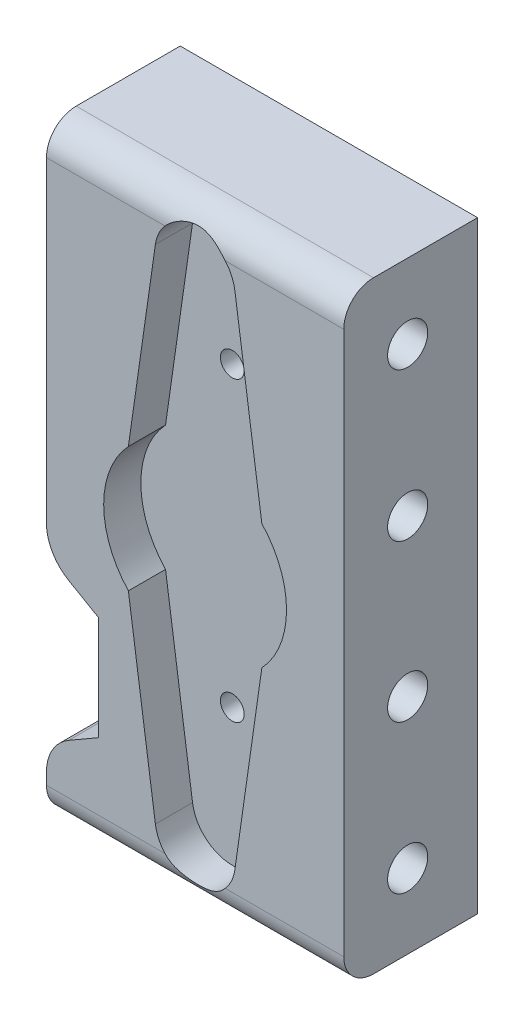
ISO-10303-21;
HEADER;
FILE_DESCRIPTION(('STEP AP214'),'2;1');
FILE_NAME('part.step','',(''),(''),'','','');
FILE_SCHEMA(('AUTOMOTIVE_DESIGN { 1 0 10303 214 1 1 1 1 }'));
ENDSEC;
DATA;
#1=APPLICATION_CONTEXT('core data for automotive mechanical design processes');
#2=APPLICATION_PROTOCOL_DEFINITION('international standard','automotive_design',2000,#1);
#3=PRODUCT_CONTEXT('',#1,'mechanical');
#4=PRODUCT('Part','Part','',(#3));
#5=PRODUCT_RELATED_PRODUCT_CATEGORY('part','',(#4));
#6=PRODUCT_DEFINITION_FORMATION('','',#4);
#7=PRODUCT_DEFINITION_CONTEXT('part definition',#1,'design');
#8=PRODUCT_DEFINITION('design','',#6,#7);
#9=PRODUCT_DEFINITION_SHAPE('','',#8);
#10=(LENGTH_UNIT() NAMED_UNIT(*) SI_UNIT(.MILLI.,.METRE.));
#11=(NAMED_UNIT(*) PLANE_ANGLE_UNIT() SI_UNIT($,.RADIAN.));
#12=(NAMED_UNIT(*) SI_UNIT($,.STERADIAN.) SOLID_ANGLE_UNIT());
#13=UNCERTAINTY_MEASURE_WITH_UNIT(LENGTH_MEASURE(1.E-05),#10,'distance_accuracy_value','');
#14=(GEOMETRIC_REPRESENTATION_CONTEXT(3) GLOBAL_UNCERTAINTY_ASSIGNED_CONTEXT((#13)) GLOBAL_UNIT_ASSIGNED_CONTEXT((#10,
#11,#12)) REPRESENTATION_CONTEXT('',''));
#15=CARTESIAN_POINT('',(0.,0.,0.));
#16=DIRECTION('',(0.,0.,1.));
#17=DIRECTION('',(1.,0.,0.));
#18=AXIS2_PLACEMENT_3D('',#15,#16,#17);
#19=CARTESIAN_POINT('',(-10.,20.28038,-9.));
#20=DIRECTION('',(-1.,0.,0.));
#21=DIRECTION('',(0.,-1.,0.));
#22=AXIS2_PLACEMENT_3D('',#19,#20,#21);
#23=PLANE('',#22);
#24=DIRECTION('',(0.,-1.,0.));
#25=VECTOR('',#24,1.);
#26=CARTESIAN_POINT('',(-10.,20.28038,0.));
#27=LINE('',#26,#25);
#28=CARTESIAN_POINT('',(-10.,-17.5179467497326,0.));
#29=VERTEX_POINT('',#28);
#30=CARTESIAN_POINT('',(-10.,-18.28038,0.));
#31=VERTEX_POINT('',#30);
#32=EDGE_CURVE('E298',#29,#31,#27,.T.);
#33=ORIENTED_EDGE('',*,*,#32,.F.);
#34=DIRECTION('',(0.,0.,-1.));
#35=VECTOR('',#34,1.);
#36=CARTESIAN_POINT('',(-10.,-17.5179467497326,-8.99999999999999));
#37=LINE('',#36,#35);
#38=CARTESIAN_POINT('',(-10.,-17.5179467497326,-9.));
#39=VERTEX_POINT('',#38);
#40=EDGE_CURVE('E43',#29,#39,#37,.T.);
#41=ORIENTED_EDGE('',*,*,#40,.T.);
#42=DIRECTION('',(0.,-1.,0.));
#43=VECTOR('',#42,1.);
#44=CARTESIAN_POINT('',(-10.,20.28038,-9.));
#45=LINE('',#44,#43);
#46=CARTESIAN_POINT('',(-10.,-20.28038,-9.));
#47=VERTEX_POINT('',#46);
#48=EDGE_CURVE('E322',#39,#47,#45,.T.);
#49=ORIENTED_EDGE('',*,*,#48,.T.);
#50=DIRECTION('',(0.,0.,1.));
#51=VECTOR('',#50,1.);
#52=CARTESIAN_POINT('',(-10.,-20.28038,-9.));
#53=LINE('',#52,#51);
#54=CARTESIAN_POINT('',(-10.,-20.28038,-2.));
#55=VERTEX_POINT('',#54);
#56=EDGE_CURVE('E345',#47,#55,#53,.T.);
#57=ORIENTED_EDGE('',*,*,#56,.T.);
#58=CARTESIAN_POINT('',(-10.,-18.28038,-2.));
#59=DIRECTION('',(-1.,0.,0.));
#60=DIRECTION('',(0.,-1.,0.));
#61=AXIS2_PLACEMENT_3D('',#58,#59,#60);
#62=CIRCLE('',#61,2.);
#63=EDGE_CURVE('E456',#55,#31,#62,.T.);
#64=ORIENTED_EDGE('',*,*,#63,.T.);
#65=EDGE_LOOP('',(#33,#41,#49,#57,#64));
#66=FACE_BOUND('',#65,.T.);
#67=ADVANCED_FACE('F35',(#66),#23,.T.);
#68=CARTESIAN_POINT('',(0.,0.,0.));
#69=DIRECTION('',(0.,0.,1.));
#70=DIRECTION('',(1.,0.,0.));
#71=AXIS2_PLACEMENT_3D('',#68,#69,#70);
#72=PLANE('',#71);
#73=CARTESIAN_POINT('',(-10.,18.28038,0.));
#74=VERTEX_POINT('',#73);
#75=CARTESIAN_POINT('',(-10.,-3.01239325026743,0.));
#76=VERTEX_POINT('',#75);
#77=EDGE_CURVE('E334',#74,#76,#27,.T.);
#78=ORIENTED_EDGE('',*,*,#77,.T.);
#79=CARTESIAN_POINT('',(-7.,-3.01239325026743,0.));
#80=DIRECTION('',(0.,0.,1.));
#81=DIRECTION('',(1.,0.,0.));
#82=AXIS2_PLACEMENT_3D('',#79,#80,#81);
#83=CIRCLE('',#82,3.);
#84=CARTESIAN_POINT('',(-8.5,-5.61046946162075,0.));
#85=VERTEX_POINT('',#84);
#86=EDGE_CURVE('E189',#76,#85,#83,.T.);
#87=ORIENTED_EDGE('',*,*,#86,.T.);
#88=DIRECTION('',(0.866025403784439,-0.499999999999999,0.));
#89=VECTOR('',#88,1.);
#90=CARTESIAN_POINT('',(-4.55440454046017,-7.88846006229943,0.));
#91=LINE('',#90,#89);
#92=CARTESIAN_POINT('',(-6.5,-6.76517,0.));
#93=VERTEX_POINT('',#92);
#94=EDGE_CURVE('E183',#85,#93,#91,.T.);
#95=ORIENTED_EDGE('',*,*,#94,.T.);
#96=DIRECTION('',(0.,1.,0.));
#97=VECTOR('',#96,1.);
#98=CARTESIAN_POINT('',(-6.5,-13.76517,0.));
#99=LINE('',#98,#97);
#100=CARTESIAN_POINT('',(-6.5,-13.76517,0.));
#101=VERTEX_POINT('',#100);
#102=EDGE_CURVE('E188',#101,#93,#99,.T.);
#103=ORIENTED_EDGE('',*,*,#102,.F.);
#104=DIRECTION('',(-0.86602540378444,-0.499999999999998,0.));
#105=VECTOR('',#104,1.);
#106=CARTESIAN_POINT('',(4.33549345370573,-7.50929493770062,0.));
#107=LINE('',#106,#105);
#108=CARTESIAN_POINT('',(-8.49999999999999,-14.9198705383793,0.));
#109=VERTEX_POINT('',#108);
#110=EDGE_CURVE('E194',#101,#109,#107,.T.);
#111=ORIENTED_EDGE('',*,*,#110,.T.);
#112=CARTESIAN_POINT('',(-7.,-17.5179467497326,0.));
#113=DIRECTION('',(0.,0.,1.));
#114=DIRECTION('',(1.,0.,0.));
#115=AXIS2_PLACEMENT_3D('',#112,#113,#114);
#116=CIRCLE('',#115,3.);
#117=EDGE_CURVE('E459',#109,#29,#116,.T.);
#118=ORIENTED_EDGE('',*,*,#117,.T.);
#119=ORIENTED_EDGE('',*,*,#32,.T.);
#120=DIRECTION('',(1.,0.,0.));
#121=VECTOR('',#120,1.);
#122=CARTESIAN_POINT('',(0.,-18.28038,0.));
#123=LINE('',#122,#121);
#124=CARTESIAN_POINT('',(-2.02983916988513,-18.28038,0.));
#125=VERTEX_POINT('',#124);
#126=EDGE_CURVE('E356',#31,#125,#123,.T.);
#127=ORIENTED_EDGE('',*,*,#126,.T.);
#128=CARTESIAN_POINT('',(0.,-16.5,0.));
#129=DIRECTION('',(0.,0.,1.));
#130=DIRECTION('',(1.,0.,0.));
#131=AXIS2_PLACEMENT_3D('',#128,#129,#130);
#132=CIRCLE('',#131,2.7);
#133=CARTESIAN_POINT('',(-2.67271739351377,-16.8828599409822,0.));
#134=VERTEX_POINT('',#133);
#135=EDGE_CURVE('E258',#134,#125,#132,.T.);
#136=ORIENTED_EDGE('',*,*,#135,.F.);
#137=DIRECTION('',(0.141799978141564,-0.989895330931029,0.));
#138=VECTOR('',#137,1.);
#139=CARTESIAN_POINT('',(-4.48896436219852,-4.2037719913087,0.));
#140=LINE('',#139,#138);
#141=CARTESIAN_POINT('',(-4.48896436219852,-4.2037719913087,0.));
#142=VERTEX_POINT('',#141);
#143=EDGE_CURVE('E254',#142,#134,#140,.T.);
#144=ORIENTED_EDGE('',*,*,#143,.F.);
#145=CARTESIAN_POINT('',(0.,0.,0.));
#146=DIRECTION('',(0.,0.,1.));
#147=DIRECTION('',(1.,0.,0.));
#148=AXIS2_PLACEMENT_3D('',#145,#146,#147);
#149=CIRCLE('',#148,6.14999999999999);
#150=CARTESIAN_POINT('',(-4.48896436219852,4.2037719913087,0.));
#151=VERTEX_POINT('',#150);
#152=EDGE_CURVE('E222',#151,#142,#149,.T.);
#153=ORIENTED_EDGE('',*,*,#152,.F.);
#154=DIRECTION('',(-0.141799978141563,-0.989895330931029,0.));
#155=VECTOR('',#154,1.);
#156=CARTESIAN_POINT('',(-2.67271739351378,16.8828599409822,0.));
#157=LINE('',#156,#155);
#158=CARTESIAN_POINT('',(-2.67271739351378,16.8828599409822,0.));
#159=VERTEX_POINT('',#158);
#160=EDGE_CURVE('E231',#159,#151,#157,.T.);
#161=ORIENTED_EDGE('',*,*,#160,.F.);
#162=CARTESIAN_POINT('',(0.,16.5,0.));
#163=DIRECTION('',(0.,0.,1.));
#164=DIRECTION('',(1.,0.,0.));
#165=AXIS2_PLACEMENT_3D('',#162,#163,#164);
#166=CIRCLE('',#165,2.7);
#167=CARTESIAN_POINT('',(-2.02983916988514,18.28038,0.));
#168=VERTEX_POINT('',#167);
#169=EDGE_CURVE('E270',#168,#159,#166,.T.);
#170=ORIENTED_EDGE('',*,*,#169,.F.);
#171=DIRECTION('',(-1.,0.,0.));
#172=VECTOR('',#171,1.);
#173=CARTESIAN_POINT('',(0.,18.28038,0.));
#174=LINE('',#173,#172);
#175=EDGE_CURVE('E341',#168,#74,#174,.T.);
#176=ORIENTED_EDGE('',*,*,#175,.T.);
#177=EDGE_LOOP('',(#78,#87,#95,#103,#111,#118,#119,#127,#136,#144,#153,#161,#170,#176));
#178=FACE_BOUND('',#177,.T.);
#179=ADVANCED_FACE('F186',(#178),#72,.T.);
#180=CARTESIAN_POINT('',(10.,20.28038,-9.));
#181=DIRECTION('',(0.,1.,0.));
#182=DIRECTION('',(0.,0.,1.));
#183=AXIS2_PLACEMENT_3D('',#180,#181,#182);
#184=PLANE('',#183);
#185=DIRECTION('',(0.,0.,1.));
#186=VECTOR('',#185,1.);
#187=CARTESIAN_POINT('',(-10.,20.28038,-9.));
#188=LINE('',#187,#186);
#189=CARTESIAN_POINT('',(-10.,20.28038,-9.));
#190=VERTEX_POINT('',#189);
#191=CARTESIAN_POINT('',(-10.,20.28038,-2.));
#192=VERTEX_POINT('',#191);
#193=EDGE_CURVE('E333',#190,#192,#188,.T.);
#194=ORIENTED_EDGE('',*,*,#193,.T.);
#195=DIRECTION('',(-1.,0.,0.));
#196=VECTOR('',#195,1.);
#197=CARTESIAN_POINT('',(10.,20.28038,-2.));
#198=LINE('',#197,#196);
#199=CARTESIAN_POINT('',(10.,20.28038,-2.));
#200=VERTEX_POINT('',#199);
#201=EDGE_CURVE('E474',#192,#200,#198,.F.);
#202=ORIENTED_EDGE('',*,*,#201,.T.);
#203=DIRECTION('',(0.,0.,1.));
#204=VECTOR('',#203,1.);
#205=CARTESIAN_POINT('',(10.,20.28038,-9.));
#206=LINE('',#205,#204);
#207=CARTESIAN_POINT('',(10.,20.28038,-9.));
#208=VERTEX_POINT('',#207);
#209=EDGE_CURVE('E338',#208,#200,#206,.T.);
#210=ORIENTED_EDGE('',*,*,#209,.F.);
#211=DIRECTION('',(-1.,0.,0.));
#212=VECTOR('',#211,1.);
#213=CARTESIAN_POINT('',(10.,20.28038,-9.));
#214=LINE('',#213,#212);
#215=EDGE_CURVE('E319',#208,#190,#214,.T.);
#216=ORIENTED_EDGE('',*,*,#215,.T.);
#217=EDGE_LOOP('',(#194,#202,#210,#216));
#218=FACE_BOUND('',#217,.T.);
#219=ADVANCED_FACE('F435',(#218),#184,.T.);
#220=CARTESIAN_POINT('',(10.,-20.28038,-9.));
#221=DIRECTION('',(1.,0.,0.));
#222=DIRECTION('',(0.,0.,-1.));
#223=AXIS2_PLACEMENT_3D('',#220,#221,#222);
#224=PLANE('',#223);
#225=CARTESIAN_POINT('',(10.,-15.26519,-4.3));
#226=DIRECTION('',(1.,0.,0.));
#227=DIRECTION('',(0.,0.,1.));
#228=AXIS2_PLACEMENT_3D('',#225,#226,#227);
#229=CIRCLE('',#228,1.35);
#230=CARTESIAN_POINT('',(10.,-15.26519,-2.95));
#231=VERTEX_POINT('',#230);
#232=EDGE_CURVE('E299',#231,#231,#229,.T.);
#233=ORIENTED_EDGE('',*,*,#232,.F.);
#234=EDGE_LOOP('',(#233));
#235=FACE_BOUND('',#234,.T.);
#236=CARTESIAN_POINT('',(10.,5.26519,-4.3));
#237=DIRECTION('',(1.,0.,0.));
#238=DIRECTION('',(0.,0.,1.));
#239=AXIS2_PLACEMENT_3D('',#236,#237,#238);
#240=CIRCLE('',#239,1.35);
#241=CARTESIAN_POINT('',(10.,5.26519,-2.95));
#242=VERTEX_POINT('',#241);
#243=EDGE_CURVE('E278',#242,#242,#240,.T.);
#244=ORIENTED_EDGE('',*,*,#243,.F.);
#245=EDGE_LOOP('',(#244));
#246=FACE_BOUND('',#245,.T.);
#247=CARTESIAN_POINT('',(10.,15.26519,-4.3));
#248=DIRECTION('',(1.,0.,0.));
#249=DIRECTION('',(0.,0.,-1.));
#250=AXIS2_PLACEMENT_3D('',#247,#248,#249);
#251=CIRCLE('',#250,1.35);
#252=CARTESIAN_POINT('',(10.,15.26519,-5.65));
#253=VERTEX_POINT('',#252);
#254=EDGE_CURVE('E306',#253,#253,#251,.T.);
#255=ORIENTED_EDGE('',*,*,#254,.F.);
#256=EDGE_LOOP('',(#255));
#257=FACE_BOUND('',#256,.T.);
#258=CARTESIAN_POINT('',(10.,-5.26519,-4.3));
#259=DIRECTION('',(1.,0.,0.));
#260=DIRECTION('',(0.,0.,-1.));
#261=AXIS2_PLACEMENT_3D('',#258,#259,#260);
#262=CIRCLE('',#261,1.35);
#263=CARTESIAN_POINT('',(10.,-5.26519,-5.65));
#264=VERTEX_POINT('',#263);
#265=EDGE_CURVE('E311',#264,#264,#262,.T.);
#266=ORIENTED_EDGE('',*,*,#265,.F.);
#267=EDGE_LOOP('',(#266));
#268=FACE_BOUND('',#267,.T.);
#269=DIRECTION('',(0.,1.,0.));
#270=VECTOR('',#269,1.);
#271=CARTESIAN_POINT('',(10.,-20.28038,0.));
#272=LINE('',#271,#270);
#273=CARTESIAN_POINT('',(10.,-18.28038,0.));
#274=VERTEX_POINT('',#273);
#275=CARTESIAN_POINT('',(10.,18.28038,0.));
#276=VERTEX_POINT('',#275);
#277=EDGE_CURVE('E323',#274,#276,#272,.T.);
#278=ORIENTED_EDGE('',*,*,#277,.F.);
#279=CARTESIAN_POINT('',(10.,-18.28038,-2.));
#280=DIRECTION('',(1.,0.,0.));
#281=DIRECTION('',(0.,0.,-1.));
#282=AXIS2_PLACEMENT_3D('',#279,#280,#281);
#283=CIRCLE('',#282,2.);
#284=CARTESIAN_POINT('',(10.,-20.28038,-2.));
#285=VERTEX_POINT('',#284);
#286=EDGE_CURVE('E520',#274,#285,#283,.T.);
#287=ORIENTED_EDGE('',*,*,#286,.T.);
#288=DIRECTION('',(0.,0.,1.));
#289=VECTOR('',#288,1.);
#290=CARTESIAN_POINT('',(10.,-20.28038,-9.));
#291=LINE('',#290,#289);
#292=CARTESIAN_POINT('',(10.,-20.28038,-9.));
#293=VERTEX_POINT('',#292);
#294=EDGE_CURVE('E342',#293,#285,#291,.T.);
#295=ORIENTED_EDGE('',*,*,#294,.F.);
#296=DIRECTION('',(0.,1.,0.));
#297=VECTOR('',#296,1.);
#298=CARTESIAN_POINT('',(10.,-20.28038,-9.));
#299=LINE('',#298,#297);
#300=EDGE_CURVE('E330',#293,#208,#299,.T.);
#301=ORIENTED_EDGE('',*,*,#300,.T.);
#302=ORIENTED_EDGE('',*,*,#209,.T.);
#303=CARTESIAN_POINT('',(10.,18.28038,-2.));
#304=DIRECTION('',(1.,0.,0.));
#305=DIRECTION('',(0.,0.,-1.));
#306=AXIS2_PLACEMENT_3D('',#303,#304,#305);
#307=CIRCLE('',#306,2.);
#308=EDGE_CURVE('E367',#200,#276,#307,.T.);
#309=ORIENTED_EDGE('',*,*,#308,.T.);
#310=EDGE_LOOP('',(#278,#287,#295,#301,#302,#309));
#311=FACE_BOUND('',#310,.T.);
#312=ADVANCED_FACE('F431',(#235,#246,#257,#268,#311),#224,.T.);
#313=CARTESIAN_POINT('',(-10.,-20.28038,-9.));
#314=DIRECTION('',(0.,-1.,0.));
#315=DIRECTION('',(0.,0.,-1.));
#316=AXIS2_PLACEMENT_3D('',#313,#314,#315);
#317=PLANE('',#316);
#318=ORIENTED_EDGE('',*,*,#294,.T.);
#319=DIRECTION('',(1.,0.,0.));
#320=VECTOR('',#319,1.);
#321=CARTESIAN_POINT('',(-10.,-20.28038,-2.));
#322=LINE('',#321,#320);
#323=EDGE_CURVE('E521',#285,#55,#322,.F.);
#324=ORIENTED_EDGE('',*,*,#323,.T.);
#325=ORIENTED_EDGE('',*,*,#56,.F.);
#326=DIRECTION('',(1.,0.,0.));
#327=VECTOR('',#326,1.);
#328=CARTESIAN_POINT('',(-10.,-20.28038,-9.));
#329=LINE('',#328,#327);
#330=EDGE_CURVE('E327',#47,#293,#329,.T.);
#331=ORIENTED_EDGE('',*,*,#330,.T.);
#332=EDGE_LOOP('',(#318,#324,#325,#331));
#333=FACE_BOUND('',#332,.T.);
#334=ADVANCED_FACE('F434',(#333),#317,.T.);
#335=CARTESIAN_POINT('',(-10.,-3.01239325026743,-9.));
#336=VERTEX_POINT('',#335);
#337=EDGE_CURVE('E324',#190,#336,#45,.T.);
#338=ORIENTED_EDGE('',*,*,#337,.T.);
#339=DIRECTION('',(0.,0.,1.));
#340=VECTOR('',#339,1.);
#341=CARTESIAN_POINT('',(-10.,-3.01239325026743,-8.99999999999999));
#342=LINE('',#341,#340);
#343=EDGE_CURVE('E193',#336,#76,#342,.T.);
#344=ORIENTED_EDGE('',*,*,#343,.T.);
#345=ORIENTED_EDGE('',*,*,#77,.F.);
#346=CARTESIAN_POINT('',(-10.,18.28038,-2.));
#347=DIRECTION('',(-1.,0.,0.));
#348=DIRECTION('',(0.,-1.,0.));
#349=AXIS2_PLACEMENT_3D('',#346,#347,#348);
#350=CIRCLE('',#349,2.);
#351=EDGE_CURVE('E523',#74,#192,#350,.T.);
#352=ORIENTED_EDGE('',*,*,#351,.T.);
#353=ORIENTED_EDGE('',*,*,#193,.F.);
#354=EDGE_LOOP('',(#338,#344,#345,#352,#353));
#355=FACE_BOUND('',#354,.T.);
#356=ADVANCED_FACE('F427',(#355),#23,.T.);
#357=CARTESIAN_POINT('',(0.,0.,-9.));
#358=DIRECTION('',(0.,0.,1.));
#359=DIRECTION('',(1.,0.,0.));
#360=AXIS2_PLACEMENT_3D('',#357,#358,#359);
#361=PLANE('',#360);
#362=DIRECTION('',(-0.866025403784439,0.499999999999999,0.));
#363=VECTOR('',#362,1.);
#364=CARTESIAN_POINT('',(-6.49999999999999,-6.76517,-9.));
#365=LINE('',#364,#363);
#366=CARTESIAN_POINT('',(-6.5,-6.76517,-9.));
#367=VERTEX_POINT('',#366);
#368=CARTESIAN_POINT('',(-8.5,-5.61046946162075,-9.));
#369=VERTEX_POINT('',#368);
#370=EDGE_CURVE('E208',#367,#369,#365,.T.);
#371=ORIENTED_EDGE('',*,*,#370,.T.);
#372=CARTESIAN_POINT('',(-7.,-3.01239325026743,-9.));
#373=DIRECTION('',(0.,0.,1.));
#374=DIRECTION('',(1.,0.,0.));
#375=AXIS2_PLACEMENT_3D('',#372,#373,#374);
#376=CIRCLE('',#375,3.);
#377=EDGE_CURVE('E460',#369,#336,#376,.F.);
#378=ORIENTED_EDGE('',*,*,#377,.T.);
#379=ORIENTED_EDGE('',*,*,#337,.F.);
#380=ORIENTED_EDGE('',*,*,#215,.F.);
#381=ORIENTED_EDGE('',*,*,#300,.F.);
#382=ORIENTED_EDGE('',*,*,#330,.F.);
#383=ORIENTED_EDGE('',*,*,#48,.F.);
#384=CARTESIAN_POINT('',(-7.,-17.5179467497326,-9.));
#385=DIRECTION('',(0.,0.,1.));
#386=DIRECTION('',(1.,0.,0.));
#387=AXIS2_PLACEMENT_3D('',#384,#385,#386);
#388=CIRCLE('',#387,3.);
#389=CARTESIAN_POINT('',(-8.49999999999999,-14.9198705383793,-9.));
#390=VERTEX_POINT('',#389);
#391=EDGE_CURVE('E50',#39,#390,#388,.F.);
#392=ORIENTED_EDGE('',*,*,#391,.T.);
#393=DIRECTION('',(0.86602540378444,0.499999999999998,0.));
#394=VECTOR('',#393,1.);
#395=CARTESIAN_POINT('',(-6.49999999999997,-13.76517,-9.));
#396=LINE('',#395,#394);
#397=CARTESIAN_POINT('',(-6.5,-13.76517,-9.));
#398=VERTEX_POINT('',#397);
#399=EDGE_CURVE('E472',#390,#398,#396,.T.);
#400=ORIENTED_EDGE('',*,*,#399,.T.);
#401=DIRECTION('',(0.,-1.,0.));
#402=VECTOR('',#401,1.);
#403=CARTESIAN_POINT('',(-6.5,-6.76517,-9.));
#404=LINE('',#403,#402);
#405=EDGE_CURVE('E209',#367,#398,#404,.T.);
#406=ORIENTED_EDGE('',*,*,#405,.F.);
#407=EDGE_LOOP('',(#371,#378,#379,#380,#381,#382,#383,#392,#400,#406));
#408=FACE_BOUND('',#407,.T.);
#409=CARTESIAN_POINT('',(0.,10.,-9.));
#410=DIRECTION('',(0.,0.,1.));
#411=DIRECTION('',(1.,0.,0.));
#412=AXIS2_PLACEMENT_3D('',#409,#410,#411);
#413=CIRCLE('',#412,0.8);
#414=CARTESIAN_POINT('',(0.800000000000001,10.,-9.));
#415=VERTEX_POINT('',#414);
#416=EDGE_CURVE('E218',#415,#415,#413,.F.);
#417=ORIENTED_EDGE('',*,*,#416,.F.);
#418=EDGE_LOOP('',(#417));
#419=FACE_BOUND('',#418,.T.);
#420=CARTESIAN_POINT('',(0.,-10.,-9.));
#421=DIRECTION('',(0.,0.,1.));
#422=DIRECTION('',(1.,0.,0.));
#423=AXIS2_PLACEMENT_3D('',#420,#421,#422);
#424=CIRCLE('',#423,0.8);
#425=CARTESIAN_POINT('',(0.800000000000001,-10.,-9.));
#426=VERTEX_POINT('',#425);
#427=EDGE_CURVE('E219',#426,#426,#424,.F.);
#428=ORIENTED_EDGE('',*,*,#427,.F.);
#429=EDGE_LOOP('',(#428));
#430=FACE_BOUND('',#429,.T.);
#431=ADVANCED_FACE('F424',(#408,#419,#430),#361,.F.);
#432=CARTESIAN_POINT('',(2.02983916988514,-18.28038,0.));
#433=VERTEX_POINT('',#432);
#434=CARTESIAN_POINT('',(2.67271739351378,-16.8828599409822,0.));
#435=VERTEX_POINT('',#434);
#436=EDGE_CURVE('E257',#433,#435,#132,.T.);
#437=ORIENTED_EDGE('',*,*,#436,.F.);
#438=DIRECTION('',(1.,0.,0.));
#439=VECTOR('',#438,1.);
#440=CARTESIAN_POINT('',(0.,-18.28038,0.));
#441=LINE('',#440,#439);
#442=EDGE_CURVE('E354',#433,#274,#441,.T.);
#443=ORIENTED_EDGE('',*,*,#442,.T.);
#444=ORIENTED_EDGE('',*,*,#277,.T.);
#445=DIRECTION('',(-1.,0.,0.));
#446=VECTOR('',#445,1.);
#447=CARTESIAN_POINT('',(0.,18.28038,0.));
#448=LINE('',#447,#446);
#449=CARTESIAN_POINT('',(2.02983916988514,18.28038,0.));
#450=VERTEX_POINT('',#449);
#451=EDGE_CURVE('E351',#276,#450,#448,.T.);
#452=ORIENTED_EDGE('',*,*,#451,.T.);
#453=CARTESIAN_POINT('',(2.67271739351378,16.8828599409822,0.));
#454=VERTEX_POINT('',#453);
#455=EDGE_CURVE('E271',#454,#450,#166,.T.);
#456=ORIENTED_EDGE('',*,*,#455,.F.);
#457=DIRECTION('',(-0.141799978141565,0.989895330931029,0.));
#458=VECTOR('',#457,1.);
#459=CARTESIAN_POINT('',(4.48896436219854,4.2037719913087,0.));
#460=LINE('',#459,#458);
#461=CARTESIAN_POINT('',(4.48896436219854,4.2037719913087,0.));
#462=VERTEX_POINT('',#461);
#463=EDGE_CURVE('E267',#462,#454,#460,.T.);
#464=ORIENTED_EDGE('',*,*,#463,.F.);
#465=CARTESIAN_POINT('',(0.,0.,0.));
#466=DIRECTION('',(0.,0.,1.));
#467=DIRECTION('',(1.,0.,0.));
#468=AXIS2_PLACEMENT_3D('',#465,#466,#467);
#469=CIRCLE('',#468,6.15);
#470=CARTESIAN_POINT('',(4.48896436219854,-4.2037719913087,0.));
#471=VERTEX_POINT('',#470);
#472=EDGE_CURVE('E264',#471,#462,#469,.T.);
#473=ORIENTED_EDGE('',*,*,#472,.F.);
#474=DIRECTION('',(0.141799978141564,0.989895330931029,0.));
#475=VECTOR('',#474,1.);
#476=CARTESIAN_POINT('',(2.67271739351378,-16.8828599409822,0.));
#477=LINE('',#476,#475);
#478=EDGE_CURVE('E261',#435,#471,#477,.T.);
#479=ORIENTED_EDGE('',*,*,#478,.F.);
#480=EDGE_LOOP('',(#437,#443,#444,#452,#456,#464,#473,#479));
#481=FACE_BOUND('',#480,.T.);
#482=ADVANCED_FACE('F416',(#481),#72,.T.);
#483=CARTESIAN_POINT('',(0.,-5.26519,-4.3));
#484=DIRECTION('',(1.,0.,0.));
#485=DIRECTION('',(0.,0.,-1.));
#486=AXIS2_PLACEMENT_3D('',#483,#484,#485);
#487=CYLINDRICAL_SURFACE('',#486,1.35);
#488=CARTESIAN_POINT('',(0.,-5.26519,-4.3));
#489=DIRECTION('',(1.,0.,0.));
#490=DIRECTION('',(0.,0.,-1.));
#491=AXIS2_PLACEMENT_3D('',#488,#489,#490);
#492=CIRCLE('',#491,1.35);
#493=CARTESIAN_POINT('',(0.,-5.26519,-5.65));
#494=VERTEX_POINT('',#493);
#495=EDGE_CURVE('E302',#494,#494,#492,.T.);
#496=ORIENTED_EDGE('',*,*,#495,.F.);
#497=EDGE_LOOP('',(#496));
#498=FACE_BOUND('',#497,.T.);
#499=ORIENTED_EDGE('',*,*,#265,.T.);
#500=EDGE_LOOP('',(#499));
#501=FACE_BOUND('',#500,.T.);
#502=ADVANCED_FACE('F412',(#498,#501),#487,.F.);
#503=CARTESIAN_POINT('',(0.,-5.26519,-4.3));
#504=DIRECTION('',(1.,0.,0.));
#505=DIRECTION('',(0.,0.,-1.));
#506=AXIS2_PLACEMENT_3D('',#503,#504,#505);
#507=PLANE('',#506);
#508=ORIENTED_EDGE('',*,*,#495,.T.);
#509=EDGE_LOOP('',(#508));
#510=FACE_BOUND('',#509,.T.);
#511=ADVANCED_FACE('F408',(#510),#507,.T.);
#512=CARTESIAN_POINT('',(0.,15.26519,-4.3));
#513=DIRECTION('',(1.,0.,0.));
#514=DIRECTION('',(0.,0.,-1.));
#515=AXIS2_PLACEMENT_3D('',#512,#513,#514);
#516=CYLINDRICAL_SURFACE('',#515,1.35);
#517=CARTESIAN_POINT('',(0.,15.26519,-4.3));
#518=DIRECTION('',(1.,0.,0.));
#519=DIRECTION('',(0.,0.,-1.));
#520=AXIS2_PLACEMENT_3D('',#517,#518,#519);
#521=CIRCLE('',#520,1.35);
#522=CARTESIAN_POINT('',(0.,15.26519,-5.65));
#523=VERTEX_POINT('',#522);
#524=EDGE_CURVE('E314',#523,#523,#521,.T.);
#525=ORIENTED_EDGE('',*,*,#524,.F.);
#526=EDGE_LOOP('',(#525));
#527=FACE_BOUND('',#526,.T.);
#528=ORIENTED_EDGE('',*,*,#254,.T.);
#529=EDGE_LOOP('',(#528));
#530=FACE_BOUND('',#529,.T.);
#531=ADVANCED_FACE('F411',(#527,#530),#516,.F.);
#532=CARTESIAN_POINT('',(0.,15.26519,-4.3));
#533=DIRECTION('',(1.,0.,0.));
#534=DIRECTION('',(0.,0.,-1.));
#535=AXIS2_PLACEMENT_3D('',#532,#533,#534);
#536=PLANE('',#535);
#537=ORIENTED_EDGE('',*,*,#524,.T.);
#538=EDGE_LOOP('',(#537));
#539=FACE_BOUND('',#538,.T.);
#540=ADVANCED_FACE('F406',(#539),#536,.T.);
#541=CARTESIAN_POINT('',(0.,5.26519,-4.3));
#542=DIRECTION('',(1.,0.,0.));
#543=DIRECTION('',(0.,0.,-1.));
#544=AXIS2_PLACEMENT_3D('',#541,#542,#543);
#545=CYLINDRICAL_SURFACE('',#544,1.35);
#546=CARTESIAN_POINT('',(0.,5.26519,-4.3));
#547=DIRECTION('',(1.,0.,0.));
#548=DIRECTION('',(0.,0.,1.));
#549=AXIS2_PLACEMENT_3D('',#546,#547,#548);
#550=CIRCLE('',#549,1.35);
#551=CARTESIAN_POINT('',(0.,5.26519,-2.95));
#552=VERTEX_POINT('',#551);
#553=EDGE_CURVE('E303',#552,#552,#550,.T.);
#554=ORIENTED_EDGE('',*,*,#553,.F.);
#555=EDGE_LOOP('',(#554));
#556=FACE_BOUND('',#555,.T.);
#557=ORIENTED_EDGE('',*,*,#243,.T.);
#558=EDGE_LOOP('',(#557));
#559=FACE_BOUND('',#558,.T.);
#560=ADVANCED_FACE('F402',(#556,#559),#545,.F.);
#561=CARTESIAN_POINT('',(0.,5.26519,-4.3));
#562=DIRECTION('',(-1.,0.,0.));
#563=DIRECTION('',(0.,0.,1.));
#564=AXIS2_PLACEMENT_3D('',#561,#562,#563);
#565=PLANE('',#564);
#566=ORIENTED_EDGE('',*,*,#553,.T.);
#567=EDGE_LOOP('',(#566));
#568=FACE_BOUND('',#567,.T.);
#569=ADVANCED_FACE('F398',(#568),#565,.F.);
#570=CARTESIAN_POINT('',(0.,-15.26519,-4.3));
#571=DIRECTION('',(1.,0.,0.));
#572=DIRECTION('',(0.,0.,-1.));
#573=AXIS2_PLACEMENT_3D('',#570,#571,#572);
#574=CYLINDRICAL_SURFACE('',#573,1.35);
#575=CARTESIAN_POINT('',(0.,-15.26519,-4.3));
#576=DIRECTION('',(1.,0.,0.));
#577=DIRECTION('',(0.,0.,1.));
#578=AXIS2_PLACEMENT_3D('',#575,#576,#577);
#579=CIRCLE('',#578,1.35);
#580=CARTESIAN_POINT('',(0.,-15.26519,-2.95));
#581=VERTEX_POINT('',#580);
#582=EDGE_CURVE('E295',#581,#581,#579,.T.);
#583=ORIENTED_EDGE('',*,*,#582,.F.);
#584=EDGE_LOOP('',(#583));
#585=FACE_BOUND('',#584,.T.);
#586=ORIENTED_EDGE('',*,*,#232,.T.);
#587=EDGE_LOOP('',(#586));
#588=FACE_BOUND('',#587,.T.);
#589=ADVANCED_FACE('F394',(#585,#588),#574,.F.);
#590=CARTESIAN_POINT('',(0.,-15.26519,-4.3));
#591=DIRECTION('',(-1.,0.,0.));
#592=DIRECTION('',(0.,0.,1.));
#593=AXIS2_PLACEMENT_3D('',#590,#591,#592);
#594=PLANE('',#593);
#595=ORIENTED_EDGE('',*,*,#582,.T.);
#596=EDGE_LOOP('',(#595));
#597=FACE_BOUND('',#596,.T.);
#598=ADVANCED_FACE('F390',(#597),#594,.F.);
#599=CARTESIAN_POINT('',(0.,0.,-2.5));
#600=DIRECTION('',(0.,0.,1.));
#601=DIRECTION('',(1.,0.,0.));
#602=AXIS2_PLACEMENT_3D('',#599,#600,#601);
#603=CYLINDRICAL_SURFACE('',#602,6.14999999999999);
#604=ORIENTED_EDGE('',*,*,#152,.T.);
#605=DIRECTION('',(0.,0.,1.));
#606=VECTOR('',#605,1.);
#607=CARTESIAN_POINT('',(-4.48896436219852,-4.2037719913087,-2.5));
#608=LINE('',#607,#606);
#609=CARTESIAN_POINT('',(-4.48896436219852,-4.2037719913087,-2.5));
#610=VERTEX_POINT('',#609);
#611=EDGE_CURVE('E252',#610,#142,#608,.T.);
#612=ORIENTED_EDGE('',*,*,#611,.F.);
#613=CARTESIAN_POINT('',(0.,0.,-2.5));
#614=DIRECTION('',(0.,0.,1.));
#615=DIRECTION('',(1.,0.,0.));
#616=AXIS2_PLACEMENT_3D('',#613,#614,#615);
#617=CIRCLE('',#616,6.14999999999999);
#618=CARTESIAN_POINT('',(-4.48896436219852,4.2037719913087,-2.5));
#619=VERTEX_POINT('',#618);
#620=EDGE_CURVE('E227',#619,#610,#617,.T.);
#621=ORIENTED_EDGE('',*,*,#620,.F.);
#622=DIRECTION('',(0.,0.,1.));
#623=VECTOR('',#622,1.);
#624=CARTESIAN_POINT('',(-4.48896436219852,4.2037719913087,-2.5));
#625=LINE('',#624,#623);
#626=EDGE_CURVE('E276',#619,#151,#625,.T.);
#627=ORIENTED_EDGE('',*,*,#626,.T.);
#628=EDGE_LOOP('',(#604,#612,#621,#627));
#629=FACE_BOUND('',#628,.T.);
#630=ADVANCED_FACE('F386',(#629),#603,.F.);
#631=CARTESIAN_POINT('',(-2.67271739351378,16.8828599409822,-2.5));
#632=DIRECTION('',(-0.989895330931029,0.141799978141563,0.));
#633=DIRECTION('',(-0.141799978141563,-0.989895330931029,0.));
#634=AXIS2_PLACEMENT_3D('',#631,#632,#633);
#635=PLANE('',#634);
#636=ORIENTED_EDGE('',*,*,#160,.T.);
#637=ORIENTED_EDGE('',*,*,#626,.F.);
#638=DIRECTION('',(-0.141799978141563,-0.989895330931029,0.));
#639=VECTOR('',#638,1.);
#640=CARTESIAN_POINT('',(-2.67271739351378,16.8828599409822,-2.5));
#641=LINE('',#640,#639);
#642=CARTESIAN_POINT('',(-2.67271739351378,16.8828599409822,-2.5));
#643=VERTEX_POINT('',#642);
#644=EDGE_CURVE('E249',#643,#619,#641,.T.);
#645=ORIENTED_EDGE('',*,*,#644,.F.);
#646=DIRECTION('',(0.,0.,1.));
#647=VECTOR('',#646,1.);
#648=CARTESIAN_POINT('',(-2.67271739351378,16.8828599409822,-2.5));
#649=LINE('',#648,#647);
#650=EDGE_CURVE('E279',#643,#159,#649,.T.);
#651=ORIENTED_EDGE('',*,*,#650,.T.);
#652=EDGE_LOOP('',(#636,#637,#645,#651));
#653=FACE_BOUND('',#652,.T.);
#654=ADVANCED_FACE('F389',(#653),#635,.F.);
#655=CARTESIAN_POINT('',(0.,16.5,-2.5));
#656=DIRECTION('',(0.,0.,1.));
#657=DIRECTION('',(1.,0.,0.));
#658=AXIS2_PLACEMENT_3D('',#655,#656,#657);
#659=CYLINDRICAL_SURFACE('',#658,2.7);
#660=ORIENTED_EDGE('',*,*,#455,.T.);
#661=CARTESIAN_POINT('',(2.02983916988514,18.28038,0.));
#662=CARTESIAN_POINT('',(1.98290264200888,18.333901362581,-3.40372899482451E-06));
#663=CARTESIAN_POINT('',(1.93389335646955,18.385498833395,-0.00214717601543784));
#664=CARTESIAN_POINT('',(1.83216143453154,18.4844922950405,-0.00982372300805636));
#665=CARTESIAN_POINT('',(1.77944372842986,18.5318936818951,-0.0153520706109146));
#666=CARTESIAN_POINT('',(1.6165164077825,18.6671993293538,-0.035648337614392));
#667=CARTESIAN_POINT('',(1.50124012164818,18.7485367861416,-0.0541384330219366));
#668=CARTESIAN_POINT('',(1.26051108498245,18.8918005008512,-0.094301765624605));
#669=CARTESIAN_POINT('',(1.13509969622722,18.9538010900261,-0.115962331303129));
#670=CARTESIAN_POINT('',(0.875619439884857,19.0578861014717,-0.156463349259888));
#671=CARTESIAN_POINT('',(0.741546620455136,19.0999613586808,-0.17530250105263));
#672=CARTESIAN_POINT('',(0.530201531429635,19.1485361187801,-0.198154097377698));
#673=CARTESIAN_POINT('',(0.454887639409383,19.1625100193531,-0.205010869584907));
#674=CARTESIAN_POINT('',(0.303111847177834,19.1840250060831,-0.215742343559848));
#675=CARTESIAN_POINT('',(0.226649936330821,19.1915660326057,-0.219617017682807));
#676=CARTESIAN_POINT('',(0.0733436456867847,19.200094551377,-0.224007994687031));
#677=CARTESIAN_POINT('',(-0.00350027452759387,19.2010885975772,-0.22452765614318));
#678=CARTESIAN_POINT('',(-0.156936385237424,19.1965275501606,-0.22216972524549));
#679=CARTESIAN_POINT('',(-0.233528593425646,19.1909729271674,-0.219292377019649));
#680=CARTESIAN_POINT('',(-0.37757285103788,19.1743437424501,-0.210892946827887));
#681=CARTESIAN_POINT('',(-0.445120822843446,19.1639281602782,-0.205689103384397));
#682=CARTESIAN_POINT('',(-0.579055800193872,19.1380584719817,-0.193181932610454));
#683=CARTESIAN_POINT('',(-0.64544238255869,19.1226025679897,-0.185877856243473));
#684=CARTESIAN_POINT('',(-0.842465106432332,19.0688090875256,-0.16153658354708));
#685=CARTESIAN_POINT('',(-0.970849355481259,19.0230592253485,-0.14207852309127));
#686=CARTESIAN_POINT('',(-1.22788940227459,18.9090447052754,-0.100338202475681));
#687=CARTESIAN_POINT('',(-1.35591248504054,18.8394078432289,-0.0779534972622816));
#688=CARTESIAN_POINT('',(-1.59945646765526,18.6800827385719,-0.0386413121317388));
#689=CARTESIAN_POINT('',(-1.71501622424546,18.5904596554798,-0.0216965252058282));
#690=CARTESIAN_POINT('',(-1.85913990829024,18.4585809584477,-0.00767380059364464));
#691=CARTESIAN_POINT('',(-1.89460836444784,18.4242916557606,-0.00487165149251139));
#692=CARTESIAN_POINT('',(-1.96366431668713,18.3537676234077,-0.00103508123559068));
#693=CARTESIAN_POINT('',(-1.99725154062093,18.3175326137445,-9.1520896416805E-07));
#694=CARTESIAN_POINT('',(-2.02983916988514,18.28038,0.));
#695=B_SPLINE_CURVE_WITH_KNOTS('',3,(#661,#662,#663,#664,#665,#666,#667,#668,#669,#670,#671,
#672,#673,#674,#675,#676,#677,#678,#679,#680,#681,#682,#683,#684,#685,#686,#687,#688,#689,#690,
#691,#692,#693,#694),.UNSPECIFIED.,.F.,.F.,(4,2,2,2,2,2,2,2,2,2,2,2,2,2,2,2,4),(0.,
0.213343095810434,0.426407728334739,0.851228400065447,1.27439533175673,1.69775671907829,
1.92818913305146,2.1586236831633,2.38882751824398,2.61901481060457,2.82440913338597,
3.02987679997382,3.44115601037627,3.88174598692305,4.32092001374779,4.46907279627339,
4.61724695621267),.UNSPECIFIED.);
#696=EDGE_CURVE('E476',#450,#168,#695,.T.);
#697=ORIENTED_EDGE('',*,*,#696,.T.);
#698=ORIENTED_EDGE('',*,*,#169,.T.);
#699=ORIENTED_EDGE('',*,*,#650,.F.);
#700=CARTESIAN_POINT('',(0.,16.5,-2.5));
#701=DIRECTION('',(0.,0.,1.));
#702=DIRECTION('',(1.,0.,0.));
#703=AXIS2_PLACEMENT_3D('',#700,#701,#702);
#704=CIRCLE('',#703,2.7);
#705=CARTESIAN_POINT('',(2.67271739351378,16.8828599409822,-2.5));
#706=VERTEX_POINT('',#705);
#707=EDGE_CURVE('E246',#706,#643,#704,.T.);
#708=ORIENTED_EDGE('',*,*,#707,.F.);
#709=DIRECTION('',(0.,0.,1.));
#710=VECTOR('',#709,1.);
#711=CARTESIAN_POINT('',(2.67271739351378,16.8828599409822,-2.5));
#712=LINE('',#711,#710);
#713=EDGE_CURVE('E282',#706,#454,#712,.T.);
#714=ORIENTED_EDGE('',*,*,#713,.T.);
#715=EDGE_LOOP('',(#660,#697,#698,#699,#708,#714));
#716=FACE_BOUND('',#715,.T.);
#717=ADVANCED_FACE('F487',(#716),#659,.F.);
#718=CARTESIAN_POINT('',(4.48896436219854,4.2037719913087,-2.5));
#719=DIRECTION('',(0.989895330931029,0.141799978141565,0.));
#720=DIRECTION('',(-0.141799978141565,0.989895330931029,0.));
#721=AXIS2_PLACEMENT_3D('',#718,#719,#720);
#722=PLANE('',#721);
#723=ORIENTED_EDGE('',*,*,#463,.T.);
#724=ORIENTED_EDGE('',*,*,#713,.F.);
#725=DIRECTION('',(-0.141799978141565,0.989895330931029,0.));
#726=VECTOR('',#725,1.);
#727=CARTESIAN_POINT('',(4.48896436219854,4.2037719913087,-2.5));
#728=LINE('',#727,#726);
#729=CARTESIAN_POINT('',(4.48896436219854,4.2037719913087,-2.5));
#730=VERTEX_POINT('',#729);
#731=EDGE_CURVE('E243',#730,#706,#728,.T.);
#732=ORIENTED_EDGE('',*,*,#731,.F.);
#733=DIRECTION('',(0.,0.,1.));
#734=VECTOR('',#733,1.);
#735=CARTESIAN_POINT('',(4.48896436219854,4.2037719913087,-2.5));
#736=LINE('',#735,#734);
#737=EDGE_CURVE('E284',#730,#462,#736,.T.);
#738=ORIENTED_EDGE('',*,*,#737,.T.);
#739=EDGE_LOOP('',(#723,#724,#732,#738));
#740=FACE_BOUND('',#739,.T.);
#741=ADVANCED_FACE('F492',(#740),#722,.F.);
#742=CARTESIAN_POINT('',(0.,0.,-2.5));
#743=DIRECTION('',(0.,0.,1.));
#744=DIRECTION('',(1.,0.,0.));
#745=AXIS2_PLACEMENT_3D('',#742,#743,#744);
#746=CYLINDRICAL_SURFACE('',#745,6.15);
#747=ORIENTED_EDGE('',*,*,#472,.T.);
#748=ORIENTED_EDGE('',*,*,#737,.F.);
#749=CARTESIAN_POINT('',(0.,0.,-2.5));
#750=DIRECTION('',(0.,0.,1.));
#751=DIRECTION('',(1.,0.,0.));
#752=AXIS2_PLACEMENT_3D('',#749,#750,#751);
#753=CIRCLE('',#752,6.15);
#754=CARTESIAN_POINT('',(4.48896436219854,-4.2037719913087,-2.5));
#755=VERTEX_POINT('',#754);
#756=EDGE_CURVE('E240',#755,#730,#753,.T.);
#757=ORIENTED_EDGE('',*,*,#756,.F.);
#758=DIRECTION('',(0.,0.,1.));
#759=VECTOR('',#758,1.);
#760=CARTESIAN_POINT('',(4.48896436219854,-4.2037719913087,-2.5));
#761=LINE('',#760,#759);
#762=EDGE_CURVE('E286',#755,#471,#761,.T.);
#763=ORIENTED_EDGE('',*,*,#762,.T.);
#764=EDGE_LOOP('',(#747,#748,#757,#763));
#765=FACE_BOUND('',#764,.T.);
#766=ADVANCED_FACE('F496',(#765),#746,.F.);
#767=CARTESIAN_POINT('',(2.67271739351378,-16.8828599409822,-2.5));
#768=DIRECTION('',(0.989895330931029,-0.141799978141564,0.));
#769=DIRECTION('',(0.141799978141564,0.989895330931029,0.));
#770=AXIS2_PLACEMENT_3D('',#767,#768,#769);
#771=PLANE('',#770);
#772=ORIENTED_EDGE('',*,*,#478,.T.);
#773=ORIENTED_EDGE('',*,*,#762,.F.);
#774=DIRECTION('',(0.141799978141564,0.989895330931029,0.));
#775=VECTOR('',#774,1.);
#776=CARTESIAN_POINT('',(2.67271739351378,-16.8828599409822,-2.5));
#777=LINE('',#776,#775);
#778=CARTESIAN_POINT('',(2.67271739351378,-16.8828599409822,-2.5));
#779=VERTEX_POINT('',#778);
#780=EDGE_CURVE('E237',#779,#755,#777,.T.);
#781=ORIENTED_EDGE('',*,*,#780,.F.);
#782=DIRECTION('',(0.,0.,1.));
#783=VECTOR('',#782,1.);
#784=CARTESIAN_POINT('',(2.67271739351378,-16.8828599409822,-2.5));
#785=LINE('',#784,#783);
#786=EDGE_CURVE('E288',#779,#435,#785,.T.);
#787=ORIENTED_EDGE('',*,*,#786,.T.);
#788=EDGE_LOOP('',(#772,#773,#781,#787));
#789=FACE_BOUND('',#788,.T.);
#790=ADVANCED_FACE('F379',(#789),#771,.F.);
#791=CARTESIAN_POINT('',(0.,-16.5,-2.5));
#792=DIRECTION('',(0.,0.,1.));
#793=DIRECTION('',(1.,0.,0.));
#794=AXIS2_PLACEMENT_3D('',#791,#792,#793);
#795=CYLINDRICAL_SURFACE('',#794,2.7);
#796=ORIENTED_EDGE('',*,*,#135,.T.);
#797=CARTESIAN_POINT('',(-2.02983916988513,-18.28038,0.));
#798=CARTESIAN_POINT('',(-1.98290264200887,-18.333901362581,-3.40372899509197E-06));
#799=CARTESIAN_POINT('',(-1.93389335646954,-18.385498833395,-0.00214717601543805));
#800=CARTESIAN_POINT('',(-1.83216143453153,-18.4844922950405,-0.00982372300805627));
#801=CARTESIAN_POINT('',(-1.77944372842985,-18.5318936818951,-0.0153520706109143));
#802=CARTESIAN_POINT('',(-1.61651640778249,-18.6671993293538,-0.0356483376143914));
#803=CARTESIAN_POINT('',(-1.50124012164817,-18.7485367861416,-0.0541384330219365));
#804=CARTESIAN_POINT('',(-1.26051108498243,-18.8918005008512,-0.0943017656246051));
#805=CARTESIAN_POINT('',(-1.1350996962272,-18.9538010900261,-0.115962331303129));
#806=CARTESIAN_POINT('',(-0.875619439884837,-19.0578861014717,-0.156463349259887));
#807=CARTESIAN_POINT('',(-0.741546620455115,-19.0999613586808,-0.175302501052629));
#808=CARTESIAN_POINT('',(-0.530201531429613,-19.1485361187801,-0.198154097377697));
#809=CARTESIAN_POINT('',(-0.454887639409362,-19.1625100193531,-0.205010869584906));
#810=CARTESIAN_POINT('',(-0.303111847177813,-19.1840250060831,-0.215742343559845));
#811=CARTESIAN_POINT('',(-0.2266499363308,-19.1915660326057,-0.219617017682804));
#812=CARTESIAN_POINT('',(-0.0733436456867635,-19.200094551377,-0.224007994687028));
#813=CARTESIAN_POINT('',(0.00350027452761514,-19.2010885975772,-0.224527656143177));
#814=CARTESIAN_POINT('',(0.156936385237445,-19.1965275501605,-0.222169725245487));
#815=CARTESIAN_POINT('',(0.233528593425667,-19.1909729271674,-0.219292377019646));
#816=CARTESIAN_POINT('',(0.3775728510379,-19.1743437424501,-0.210892946827884));
#817=CARTESIAN_POINT('',(0.445120822843467,-19.1639281602782,-0.205689103384393));
#818=CARTESIAN_POINT('',(0.579055800193893,-19.1380584719817,-0.19318193261045));
#819=CARTESIAN_POINT('',(0.64544238255871,-19.1226025679897,-0.185877856243469));
#820=CARTESIAN_POINT('',(0.842465106432352,-19.0688090875256,-0.161536583547076));
#821=CARTESIAN_POINT('',(0.970849355481279,-19.0230592253485,-0.142078523091266));
#822=CARTESIAN_POINT('',(1.22788940227461,-18.9090447052754,-0.100338202475677));
#823=CARTESIAN_POINT('',(1.35591248504056,-18.8394078432289,-0.0779534972622777));
#824=CARTESIAN_POINT('',(1.59945646765528,-18.6800827385719,-0.0386413121317355));
#825=CARTESIAN_POINT('',(1.71501622424548,-18.5904596554798,-0.0216965252058255));
#826=CARTESIAN_POINT('',(1.85913990829026,-18.4585809584477,-0.00767380059364329));
#827=CARTESIAN_POINT('',(1.89460836444785,-18.4242916557605,-0.00487165149251049));
#828=CARTESIAN_POINT('',(1.96366431668713,-18.3537676234077,-0.0010350812355904));
#829=CARTESIAN_POINT('',(1.99725154062093,-18.3175326137445,-9.15208964028595E-07));
#830=CARTESIAN_POINT('',(2.02983916988514,-18.28038,0.));
#831=B_SPLINE_CURVE_WITH_KNOTS('',3,(#797,#798,#799,#800,#801,#802,#803,#804,#805,#806,#807,
#808,#809,#810,#811,#812,#813,#814,#815,#816,#817,#818,#819,#820,#821,#822,#823,#824,#825,#826,
#827,#828,#829,#830),.UNSPECIFIED.,.F.,.F.,(4,2,2,2,2,2,2,2,2,2,2,2,2,2,2,2,4),(0.,
0.213343095810434,0.426407728334741,0.85122840006545,1.27439533175674,1.69775671907829,
1.92818913305146,2.15862368316331,2.38882751824398,2.61901481060458,2.82440913338597,
3.02987679997383,3.44115601037628,3.88174598692305,4.3209200137478,4.46907279627339,
4.61724695621265),.UNSPECIFIED.);
#832=EDGE_CURVE('E359',#125,#433,#831,.T.);
#833=ORIENTED_EDGE('',*,*,#832,.T.);
#834=ORIENTED_EDGE('',*,*,#436,.T.);
#835=ORIENTED_EDGE('',*,*,#786,.F.);
#836=CARTESIAN_POINT('',(0.,-16.5,-2.5));
#837=DIRECTION('',(0.,0.,1.));
#838=DIRECTION('',(1.,0.,0.));
#839=AXIS2_PLACEMENT_3D('',#836,#837,#838);
#840=CIRCLE('',#839,2.7);
#841=CARTESIAN_POINT('',(-2.67271739351377,-16.8828599409822,-2.5));
#842=VERTEX_POINT('',#841);
#843=EDGE_CURVE('E234',#842,#779,#840,.T.);
#844=ORIENTED_EDGE('',*,*,#843,.F.);
#845=DIRECTION('',(0.,0.,1.));
#846=VECTOR('',#845,1.);
#847=CARTESIAN_POINT('',(-2.67271739351377,-16.8828599409822,-2.5));
#848=LINE('',#847,#846);
#849=EDGE_CURVE('E291',#842,#134,#848,.T.);
#850=ORIENTED_EDGE('',*,*,#849,.T.);
#851=EDGE_LOOP('',(#796,#833,#834,#835,#844,#850));
#852=FACE_BOUND('',#851,.T.);
#853=ADVANCED_FACE('F373',(#852),#795,.F.);
#854=CARTESIAN_POINT('',(-4.48896436219852,-4.2037719913087,-2.5));
#855=DIRECTION('',(-0.989895330931029,-0.141799978141564,0.));
#856=DIRECTION('',(0.141799978141564,-0.989895330931029,0.));
#857=AXIS2_PLACEMENT_3D('',#854,#855,#856);
#858=PLANE('',#857);
#859=ORIENTED_EDGE('',*,*,#143,.T.);
#860=ORIENTED_EDGE('',*,*,#849,.F.);
#861=DIRECTION('',(0.141799978141564,-0.989895330931029,0.));
#862=VECTOR('',#861,1.);
#863=CARTESIAN_POINT('',(-4.48896436219852,-4.2037719913087,-2.5));
#864=LINE('',#863,#862);
#865=EDGE_CURVE('E230',#610,#842,#864,.T.);
#866=ORIENTED_EDGE('',*,*,#865,.F.);
#867=ORIENTED_EDGE('',*,*,#611,.T.);
#868=EDGE_LOOP('',(#859,#860,#866,#867));
#869=FACE_BOUND('',#868,.T.);
#870=ADVANCED_FACE('F378',(#869),#858,.F.);
#871=CARTESIAN_POINT('',(0.,0.,-2.5));
#872=DIRECTION('',(0.,0.,1.));
#873=DIRECTION('',(1.,0.,0.));
#874=AXIS2_PLACEMENT_3D('',#871,#872,#873);
#875=PLANE('',#874);
#876=CARTESIAN_POINT('',(0.,10.,-2.5));
#877=DIRECTION('',(0.,0.,1.));
#878=DIRECTION('',(1.,0.,0.));
#879=AXIS2_PLACEMENT_3D('',#876,#877,#878);
#880=CIRCLE('',#879,0.8);
#881=CARTESIAN_POINT('',(0.800000000000001,10.,-2.5));
#882=VERTEX_POINT('',#881);
#883=EDGE_CURVE('E215',#882,#882,#880,.T.);
#884=ORIENTED_EDGE('',*,*,#883,.F.);
#885=EDGE_LOOP('',(#884));
#886=FACE_BOUND('',#885,.T.);
#887=CARTESIAN_POINT('',(0.,-10.,-2.5));
#888=DIRECTION('',(0.,0.,1.));
#889=DIRECTION('',(-1.,0.,0.));
#890=AXIS2_PLACEMENT_3D('',#887,#888,#889);
#891=CIRCLE('',#890,0.8);
#892=CARTESIAN_POINT('',(-0.799999999999999,-10.,-2.5));
#893=VERTEX_POINT('',#892);
#894=EDGE_CURVE('E214',#893,#893,#891,.T.);
#895=ORIENTED_EDGE('',*,*,#894,.F.);
#896=EDGE_LOOP('',(#895));
#897=FACE_BOUND('',#896,.T.);
#898=ORIENTED_EDGE('',*,*,#620,.T.);
#899=ORIENTED_EDGE('',*,*,#865,.T.);
#900=ORIENTED_EDGE('',*,*,#843,.T.);
#901=ORIENTED_EDGE('',*,*,#780,.T.);
#902=ORIENTED_EDGE('',*,*,#756,.T.);
#903=ORIENTED_EDGE('',*,*,#731,.T.);
#904=ORIENTED_EDGE('',*,*,#707,.T.);
#905=ORIENTED_EDGE('',*,*,#644,.T.);
#906=EDGE_LOOP('',(#898,#899,#900,#901,#902,#903,#904,#905));
#907=FACE_BOUND('',#906,.T.);
#908=ADVANCED_FACE('F384',(#886,#897,#907),#875,.T.);
#909=CARTESIAN_POINT('',(0.,-18.28038,-2.));
#910=DIRECTION('',(1.,0.,0.));
#911=DIRECTION('',(0.,0.,-1.));
#912=AXIS2_PLACEMENT_3D('',#909,#910,#911);
#913=CYLINDRICAL_SURFACE('',#912,2.);
#914=ORIENTED_EDGE('',*,*,#63,.F.);
#915=ORIENTED_EDGE('',*,*,#323,.F.);
#916=ORIENTED_EDGE('',*,*,#286,.F.);
#917=ORIENTED_EDGE('',*,*,#442,.F.);
#918=ORIENTED_EDGE('',*,*,#832,.F.);
#919=ORIENTED_EDGE('',*,*,#126,.F.);
#920=EDGE_LOOP('',(#914,#915,#916,#917,#918,#919));
#921=FACE_BOUND('',#920,.T.);
#922=ADVANCED_FACE('F369',(#921),#913,.T.);
#923=CARTESIAN_POINT('',(0.,18.28038,-2.));
#924=DIRECTION('',(-1.,0.,0.));
#925=DIRECTION('',(0.,0.,1.));
#926=AXIS2_PLACEMENT_3D('',#923,#924,#925);
#927=CYLINDRICAL_SURFACE('',#926,2.);
#928=ORIENTED_EDGE('',*,*,#308,.F.);
#929=ORIENTED_EDGE('',*,*,#201,.F.);
#930=ORIENTED_EDGE('',*,*,#351,.F.);
#931=ORIENTED_EDGE('',*,*,#175,.F.);
#932=ORIENTED_EDGE('',*,*,#696,.F.);
#933=ORIENTED_EDGE('',*,*,#451,.F.);
#934=EDGE_LOOP('',(#928,#929,#930,#931,#932,#933));
#935=FACE_BOUND('',#934,.T.);
#936=ADVANCED_FACE('F484',(#935),#927,.T.);
#937=CARTESIAN_POINT('',(0.,-10.,-11.262741699797));
#938=DIRECTION('',(0.,0.,1.));
#939=DIRECTION('',(1.,0.,0.));
#940=AXIS2_PLACEMENT_3D('',#937,#938,#939);
#941=CYLINDRICAL_SURFACE('',#940,0.8);
#942=ORIENTED_EDGE('',*,*,#427,.T.);
#943=EDGE_LOOP('',(#942));
#944=FACE_BOUND('',#943,.T.);
#945=ORIENTED_EDGE('',*,*,#894,.T.);
#946=EDGE_LOOP('',(#945));
#947=FACE_BOUND('',#946,.T.);
#948=ADVANCED_FACE('F691',(#944,#947),#941,.F.);
#949=CARTESIAN_POINT('',(0.,10.,-11.262741699797));
#950=DIRECTION('',(0.,0.,1.));
#951=DIRECTION('',(1.,0.,0.));
#952=AXIS2_PLACEMENT_3D('',#949,#950,#951);
#953=CYLINDRICAL_SURFACE('',#952,0.8);
#954=ORIENTED_EDGE('',*,*,#416,.T.);
#955=EDGE_LOOP('',(#954));
#956=FACE_BOUND('',#955,.T.);
#957=ORIENTED_EDGE('',*,*,#883,.T.);
#958=EDGE_LOOP('',(#957));
#959=FACE_BOUND('',#958,.T.);
#960=ADVANCED_FACE('F698',(#956,#959),#953,.F.);
#961=CARTESIAN_POINT('',(-6.5,0.,0.));
#962=DIRECTION('',(-1.,0.,0.));
#963=DIRECTION('',(0.,-1.,0.));
#964=AXIS2_PLACEMENT_3D('',#961,#962,#963);
#965=PLANE('',#964);
#966=ORIENTED_EDGE('',*,*,#102,.T.);
#967=DIRECTION('',(0.,0.,-1.));
#968=VECTOR('',#967,1.);
#969=CARTESIAN_POINT('',(-6.5,-6.76517,0.));
#970=LINE('',#969,#968);
#971=EDGE_CURVE('E201',#93,#367,#970,.T.);
#972=ORIENTED_EDGE('',*,*,#971,.T.);
#973=ORIENTED_EDGE('',*,*,#405,.T.);
#974=DIRECTION('',(0.,0.,1.));
#975=VECTOR('',#974,1.);
#976=CARTESIAN_POINT('',(-6.5,-13.76517,0.));
#977=LINE('',#976,#975);
#978=EDGE_CURVE('E204',#398,#101,#977,.T.);
#979=ORIENTED_EDGE('',*,*,#978,.T.);
#980=EDGE_LOOP('',(#966,#972,#973,#979));
#981=FACE_BOUND('',#980,.T.);
#982=ADVANCED_FACE('F199',(#981),#965,.T.);
#983=CARTESIAN_POINT('',(-6.49999999999999,-6.76517,0.));
#984=DIRECTION('',(-0.499999999999999,-0.866025403784439,0.));
#985=DIRECTION('',(0.,0.,1.));
#986=AXIS2_PLACEMENT_3D('',#983,#984,#985);
#987=PLANE('',#986);
#988=ORIENTED_EDGE('',*,*,#94,.F.);
#989=DIRECTION('',(0.,0.,1.));
#990=VECTOR('',#989,1.);
#991=CARTESIAN_POINT('',(-8.5,-5.61046946162075,0.));
#992=LINE('',#991,#990);
#993=EDGE_CURVE('E464',#85,#369,#992,.F.);
#994=ORIENTED_EDGE('',*,*,#993,.T.);
#995=ORIENTED_EDGE('',*,*,#370,.F.);
#996=ORIENTED_EDGE('',*,*,#971,.F.);
#997=EDGE_LOOP('',(#988,#994,#995,#996));
#998=FACE_BOUND('',#997,.T.);
#999=ADVANCED_FACE('F206',(#998),#987,.T.);
#1000=CARTESIAN_POINT('',(-6.49999999999997,-13.76517,0.));
#1001=DIRECTION('',(-0.499999999999998,0.86602540378444,0.));
#1002=DIRECTION('',(0.,0.,-1.));
#1003=AXIS2_PLACEMENT_3D('',#1000,#1001,#1002);
#1004=PLANE('',#1003);
#1005=ORIENTED_EDGE('',*,*,#399,.F.);
#1006=DIRECTION('',(0.,0.,-1.));
#1007=VECTOR('',#1006,1.);
#1008=CARTESIAN_POINT('',(-8.49999999999999,-14.9198705383793,0.));
#1009=LINE('',#1008,#1007);
#1010=EDGE_CURVE('E11',#390,#109,#1009,.F.);
#1011=ORIENTED_EDGE('',*,*,#1010,.T.);
#1012=ORIENTED_EDGE('',*,*,#110,.F.);
#1013=ORIENTED_EDGE('',*,*,#978,.F.);
#1014=EDGE_LOOP('',(#1005,#1011,#1012,#1013));
#1015=FACE_BOUND('',#1014,.T.);
#1016=ADVANCED_FACE('F724',(#1015),#1004,.T.);
#1017=CARTESIAN_POINT('',(-7.,-3.01239325026743,-8.99999999999999));
#1018=DIRECTION('',(0.,0.,1.));
#1019=DIRECTION('',(0.,-1.,0.));
#1020=AXIS2_PLACEMENT_3D('',#1017,#1018,#1019);
#1021=CYLINDRICAL_SURFACE('',#1020,3.);
#1022=ORIENTED_EDGE('',*,*,#377,.F.);
#1023=ORIENTED_EDGE('',*,*,#993,.F.);
#1024=ORIENTED_EDGE('',*,*,#86,.F.);
#1025=ORIENTED_EDGE('',*,*,#343,.F.);
#1026=EDGE_LOOP('',(#1022,#1023,#1024,#1025));
#1027=FACE_BOUND('',#1026,.T.);
#1028=ADVANCED_FACE('F731',(#1027),#1021,.T.);
#1029=CARTESIAN_POINT('',(-7.,-17.5179467497326,-8.99999999999999));
#1030=DIRECTION('',(0.,0.,-1.));
#1031=DIRECTION('',(0.,1.,0.));
#1032=AXIS2_PLACEMENT_3D('',#1029,#1030,#1031);
#1033=CYLINDRICAL_SURFACE('',#1032,3.);
#1034=ORIENTED_EDGE('',*,*,#117,.F.);
#1035=ORIENTED_EDGE('',*,*,#1010,.F.);
#1036=ORIENTED_EDGE('',*,*,#391,.F.);
#1037=ORIENTED_EDGE('',*,*,#40,.F.);
#1038=EDGE_LOOP('',(#1034,#1035,#1036,#1037));
#1039=FACE_BOUND('',#1038,.T.);
#1040=ADVANCED_FACE('F37',(#1039),#1033,.T.);
#1041=CLOSED_SHELL('',(#67,#179,#219,#312,#334,#356,#431,#482,#502,#511,#531,#540,#560,#569,
#589,#598,#630,#654,#717,#741,#766,#790,#853,#870,#908,#922,#936,#948,#960,#982,#999,#1016,
#1028,#1040));
#1042=MANIFOLD_SOLID_BREP('B2',#1041);
#1043=ADVANCED_BREP_SHAPE_REPRESENTATION('',(#18,#1042),#14);
#1044=SHAPE_DEFINITION_REPRESENTATION(#9,#1043);
ENDSEC;
END-ISO-10303-21;
